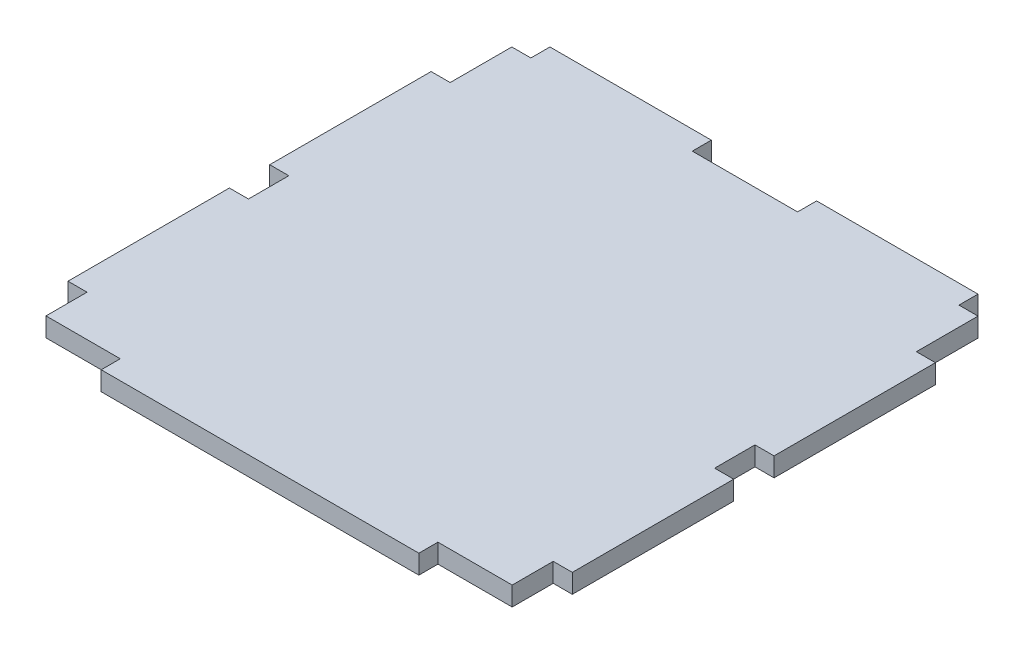
ISO-10303-21;
HEADER;
FILE_DESCRIPTION(('STEP AP214'),'2;1');
FILE_NAME('part.step','',(''),(''),'','','');
FILE_SCHEMA(('AUTOMOTIVE_DESIGN { 1 0 10303 214 1 1 1 1 }'));
ENDSEC;
DATA;
#1=APPLICATION_CONTEXT('core data for automotive mechanical design processes');
#2=APPLICATION_PROTOCOL_DEFINITION('international standard','automotive_design',2000,#1);
#3=PRODUCT_CONTEXT('',#1,'mechanical');
#4=PRODUCT('Part','Part','',(#3));
#5=PRODUCT_RELATED_PRODUCT_CATEGORY('part','',(#4));
#6=PRODUCT_DEFINITION_FORMATION('','',#4);
#7=PRODUCT_DEFINITION_CONTEXT('part definition',#1,'design');
#8=PRODUCT_DEFINITION('design','',#6,#7);
#9=PRODUCT_DEFINITION_SHAPE('','',#8);
#10=(LENGTH_UNIT() NAMED_UNIT(*) SI_UNIT(.MILLI.,.METRE.));
#11=(NAMED_UNIT(*) PLANE_ANGLE_UNIT() SI_UNIT($,.RADIAN.));
#12=(NAMED_UNIT(*) SI_UNIT($,.STERADIAN.) SOLID_ANGLE_UNIT());
#13=UNCERTAINTY_MEASURE_WITH_UNIT(LENGTH_MEASURE(1.E-05),#10,'distance_accuracy_value','');
#14=(GEOMETRIC_REPRESENTATION_CONTEXT(3) GLOBAL_UNCERTAINTY_ASSIGNED_CONTEXT((#13)) GLOBAL_UNIT_ASSIGNED_CONTEXT((#10,
#11,#12)) REPRESENTATION_CONTEXT('',''));
#15=CARTESIAN_POINT('',(0.,0.,0.));
#16=DIRECTION('',(0.,0.,1.));
#17=DIRECTION('',(1.,0.,0.));
#18=AXIS2_PLACEMENT_3D('',#15,#16,#17);
#19=CARTESIAN_POINT('',(0.,3.,35.155));
#20=DIRECTION('',(0.,0.,1.));
#21=DIRECTION('',(1.,0.,0.));
#22=AXIS2_PLACEMENT_3D('',#19,#20,#21);
#23=PLANE('',#22);
#24=DIRECTION('',(-1.,0.,0.));
#25=VECTOR('',#24,1.);
#26=CARTESIAN_POINT('',(0.,0.,35.155));
#27=LINE('',#26,#25);
#28=CARTESIAN_POINT('',(36.685,0.,35.155));
#29=VERTEX_POINT('',#28);
#30=CARTESIAN_POINT('',(24.995,0.,35.155));
#31=VERTEX_POINT('',#30);
#32=EDGE_CURVE('E271',#29,#31,#27,.T.);
#33=ORIENTED_EDGE('',*,*,#32,.F.);
#34=DIRECTION('',(0.,-1.,0.));
#35=VECTOR('',#34,1.);
#36=CARTESIAN_POINT('',(36.685,3.,35.155));
#37=LINE('',#36,#35);
#38=CARTESIAN_POINT('',(36.685,3.,35.155));
#39=VERTEX_POINT('',#38);
#40=EDGE_CURVE('E11',#39,#29,#37,.T.);
#41=ORIENTED_EDGE('',*,*,#40,.F.);
#42=DIRECTION('',(-1.,0.,0.));
#43=VECTOR('',#42,1.);
#44=CARTESIAN_POINT('',(0.,3.,35.155));
#45=LINE('',#44,#43);
#46=CARTESIAN_POINT('',(24.995,3.,35.155));
#47=VERTEX_POINT('',#46);
#48=EDGE_CURVE('E349',#39,#47,#45,.T.);
#49=ORIENTED_EDGE('',*,*,#48,.T.);
#50=DIRECTION('',(0.,-1.,0.));
#51=VECTOR('',#50,1.);
#52=CARTESIAN_POINT('',(24.995,3.,35.155));
#53=LINE('',#52,#51);
#54=EDGE_CURVE('E48',#47,#31,#53,.T.);
#55=ORIENTED_EDGE('',*,*,#54,.T.);
#56=EDGE_LOOP('',(#33,#41,#49,#55));
#57=FACE_BOUND('',#56,.T.);
#58=ADVANCED_FACE('F32',(#57),#23,.T.);
#59=CARTESIAN_POINT('',(36.685,3.,0.));
#60=DIRECTION('',(-1.,0.,0.));
#61=DIRECTION('',(0.,0.,1.));
#62=AXIS2_PLACEMENT_3D('',#59,#60,#61);
#63=PLANE('',#62);
#64=DIRECTION('',(0.,0.,-1.));
#65=VECTOR('',#64,1.);
#66=CARTESIAN_POINT('',(36.685,0.,0.));
#67=LINE('',#66,#65);
#68=CARTESIAN_POINT('',(36.685,0.,28.695));
#69=VERTEX_POINT('',#68);
#70=EDGE_CURVE('E273',#29,#69,#67,.T.);
#71=ORIENTED_EDGE('',*,*,#70,.T.);
#72=DIRECTION('',(0.,-1.,0.));
#73=VECTOR('',#72,1.);
#74=CARTESIAN_POINT('',(36.685,3.,28.695));
#75=LINE('',#74,#73);
#76=CARTESIAN_POINT('',(36.685,3.,28.695));
#77=VERTEX_POINT('',#76);
#78=EDGE_CURVE('E40',#77,#69,#75,.T.);
#79=ORIENTED_EDGE('',*,*,#78,.F.);
#80=DIRECTION('',(0.,0.,-1.));
#81=VECTOR('',#80,1.);
#82=CARTESIAN_POINT('',(36.685,3.,0.));
#83=LINE('',#82,#81);
#84=EDGE_CURVE('E878',#39,#77,#83,.T.);
#85=ORIENTED_EDGE('',*,*,#84,.F.);
#86=ORIENTED_EDGE('',*,*,#40,.T.);
#87=EDGE_LOOP('',(#71,#79,#85,#86));
#88=FACE_BOUND('',#87,.T.);
#89=ADVANCED_FACE('F525',(#88),#63,.F.);
#90=CARTESIAN_POINT('',(0.,3.,28.695));
#91=DIRECTION('',(0.,0.,-1.));
#92=DIRECTION('',(-1.,0.,0.));
#93=AXIS2_PLACEMENT_3D('',#90,#91,#92);
#94=PLANE('',#93);
#95=DIRECTION('',(1.,0.,0.));
#96=VECTOR('',#95,1.);
#97=CARTESIAN_POINT('',(0.,0.,28.695));
#98=LINE('',#97,#96);
#99=CARTESIAN_POINT('',(39.685,0.,28.695));
#100=VERTEX_POINT('',#99);
#101=EDGE_CURVE('E275',#69,#100,#98,.T.);
#102=ORIENTED_EDGE('',*,*,#101,.T.);
#103=DIRECTION('',(0.,-1.,0.));
#104=VECTOR('',#103,1.);
#105=CARTESIAN_POINT('',(39.685,3.,28.695));
#106=LINE('',#105,#104);
#107=CARTESIAN_POINT('',(39.685,3.,28.695));
#108=VERTEX_POINT('',#107);
#109=EDGE_CURVE('E414',#108,#100,#106,.T.);
#110=ORIENTED_EDGE('',*,*,#109,.F.);
#111=DIRECTION('',(1.,0.,0.));
#112=VECTOR('',#111,1.);
#113=CARTESIAN_POINT('',(0.,3.,28.695));
#114=LINE('',#113,#112);
#115=EDGE_CURVE('E423',#77,#108,#114,.T.);
#116=ORIENTED_EDGE('',*,*,#115,.F.);
#117=ORIENTED_EDGE('',*,*,#78,.T.);
#118=EDGE_LOOP('',(#102,#110,#116,#117));
#119=FACE_BOUND('',#118,.T.);
#120=ADVANCED_FACE('F421',(#119),#94,.F.);
#121=CARTESIAN_POINT('',(39.685,3.,0.));
#122=DIRECTION('',(-1.,0.,0.));
#123=DIRECTION('',(0.,0.,1.));
#124=AXIS2_PLACEMENT_3D('',#121,#122,#123);
#125=PLANE('',#124);
#126=DIRECTION('',(0.,0.,-1.));
#127=VECTOR('',#126,1.);
#128=CARTESIAN_POINT('',(39.685,0.,0.));
#129=LINE('',#128,#127);
#130=CARTESIAN_POINT('',(39.685,0.,3.29499999999999));
#131=VERTEX_POINT('',#130);
#132=EDGE_CURVE('E277',#100,#131,#129,.T.);
#133=ORIENTED_EDGE('',*,*,#132,.T.);
#134=DIRECTION('',(0.,-1.,0.));
#135=VECTOR('',#134,1.);
#136=CARTESIAN_POINT('',(39.685,3.,3.29499999999999));
#137=LINE('',#136,#135);
#138=CARTESIAN_POINT('',(39.685,3.,3.29499999999999));
#139=VERTEX_POINT('',#138);
#140=EDGE_CURVE('E411',#139,#131,#137,.T.);
#141=ORIENTED_EDGE('',*,*,#140,.F.);
#142=DIRECTION('',(0.,0.,-1.));
#143=VECTOR('',#142,1.);
#144=CARTESIAN_POINT('',(39.685,3.,0.));
#145=LINE('',#144,#143);
#146=EDGE_CURVE('E442',#108,#139,#145,.T.);
#147=ORIENTED_EDGE('',*,*,#146,.F.);
#148=ORIENTED_EDGE('',*,*,#109,.T.);
#149=EDGE_LOOP('',(#133,#141,#147,#148));
#150=FACE_BOUND('',#149,.T.);
#151=ADVANCED_FACE('F433',(#150),#125,.F.);
#152=CARTESIAN_POINT('',(0.,3.,3.29499999999998));
#153=DIRECTION('',(0.,0.,1.));
#154=DIRECTION('',(1.,0.,0.));
#155=AXIS2_PLACEMENT_3D('',#152,#153,#154);
#156=PLANE('',#155);
#157=DIRECTION('',(-1.,0.,0.));
#158=VECTOR('',#157,1.);
#159=CARTESIAN_POINT('',(0.,0.,3.29499999999998));
#160=LINE('',#159,#158);
#161=CARTESIAN_POINT('',(36.685,0.,3.29499999999999));
#162=VERTEX_POINT('',#161);
#163=EDGE_CURVE('E279',#131,#162,#160,.T.);
#164=ORIENTED_EDGE('',*,*,#163,.T.);
#165=DIRECTION('',(0.,-1.,0.));
#166=VECTOR('',#165,1.);
#167=CARTESIAN_POINT('',(36.685,3.,3.29499999999999));
#168=LINE('',#167,#166);
#169=CARTESIAN_POINT('',(36.685,3.,3.29499999999999));
#170=VERTEX_POINT('',#169);
#171=EDGE_CURVE('E408',#170,#162,#168,.T.);
#172=ORIENTED_EDGE('',*,*,#171,.F.);
#173=DIRECTION('',(-1.,0.,0.));
#174=VECTOR('',#173,1.);
#175=CARTESIAN_POINT('',(0.,3.,3.29499999999998));
#176=LINE('',#175,#174);
#177=EDGE_CURVE('E439',#139,#170,#176,.T.);
#178=ORIENTED_EDGE('',*,*,#177,.F.);
#179=ORIENTED_EDGE('',*,*,#140,.T.);
#180=EDGE_LOOP('',(#164,#172,#178,#179));
#181=FACE_BOUND('',#180,.T.);
#182=ADVANCED_FACE('F437',(#181),#156,.F.);
#183=CARTESIAN_POINT('',(36.685,3.,0.));
#184=DIRECTION('',(-1.,0.,0.));
#185=DIRECTION('',(0.,0.,1.));
#186=AXIS2_PLACEMENT_3D('',#183,#184,#185);
#187=PLANE('',#186);
#188=DIRECTION('',(0.,0.,-1.));
#189=VECTOR('',#188,1.);
#190=CARTESIAN_POINT('',(36.685,0.,0.));
#191=LINE('',#190,#189);
#192=CARTESIAN_POINT('',(36.685,0.,-3.05500000000001));
#193=VERTEX_POINT('',#192);
#194=EDGE_CURVE('E281',#162,#193,#191,.T.);
#195=ORIENTED_EDGE('',*,*,#194,.T.);
#196=DIRECTION('',(0.,-1.,0.));
#197=VECTOR('',#196,1.);
#198=CARTESIAN_POINT('',(36.685,3.,-3.05500000000001));
#199=LINE('',#198,#197);
#200=CARTESIAN_POINT('',(36.685,3.,-3.05500000000001));
#201=VERTEX_POINT('',#200);
#202=EDGE_CURVE('E405',#201,#193,#199,.T.);
#203=ORIENTED_EDGE('',*,*,#202,.F.);
#204=DIRECTION('',(0.,0.,-1.));
#205=VECTOR('',#204,1.);
#206=CARTESIAN_POINT('',(36.685,3.,0.));
#207=LINE('',#206,#205);
#208=EDGE_CURVE('E441',#170,#201,#207,.T.);
#209=ORIENTED_EDGE('',*,*,#208,.F.);
#210=ORIENTED_EDGE('',*,*,#171,.T.);
#211=EDGE_LOOP('',(#195,#203,#209,#210));
#212=FACE_BOUND('',#211,.T.);
#213=ADVANCED_FACE('F780',(#212),#187,.F.);
#214=CARTESIAN_POINT('',(0.,3.,-3.05500000000001));
#215=DIRECTION('',(0.,0.,-1.));
#216=DIRECTION('',(-1.,0.,0.));
#217=AXIS2_PLACEMENT_3D('',#214,#215,#216);
#218=PLANE('',#217);
#219=DIRECTION('',(1.,0.,0.));
#220=VECTOR('',#219,1.);
#221=CARTESIAN_POINT('',(0.,0.,-3.05500000000001));
#222=LINE('',#221,#220);
#223=CARTESIAN_POINT('',(39.685,0.,-3.05500000000001));
#224=VERTEX_POINT('',#223);
#225=EDGE_CURVE('E283',#193,#224,#222,.T.);
#226=ORIENTED_EDGE('',*,*,#225,.T.);
#227=DIRECTION('',(0.,-1.,0.));
#228=VECTOR('',#227,1.);
#229=CARTESIAN_POINT('',(39.685,3.,-3.05500000000001));
#230=LINE('',#229,#228);
#231=CARTESIAN_POINT('',(39.685,3.,-3.05500000000001));
#232=VERTEX_POINT('',#231);
#233=EDGE_CURVE('E402',#232,#224,#230,.T.);
#234=ORIENTED_EDGE('',*,*,#233,.F.);
#235=DIRECTION('',(1.,0.,0.));
#236=VECTOR('',#235,1.);
#237=CARTESIAN_POINT('',(0.,3.,-3.05500000000001));
#238=LINE('',#237,#236);
#239=EDGE_CURVE('E444',#201,#232,#238,.T.);
#240=ORIENTED_EDGE('',*,*,#239,.F.);
#241=ORIENTED_EDGE('',*,*,#202,.T.);
#242=EDGE_LOOP('',(#226,#234,#240,#241));
#243=FACE_BOUND('',#242,.T.);
#244=ADVANCED_FACE('F770',(#243),#218,.F.);
#245=CARTESIAN_POINT('',(39.685,3.,0.));
#246=DIRECTION('',(-1.,0.,0.));
#247=DIRECTION('',(0.,0.,1.));
#248=AXIS2_PLACEMENT_3D('',#245,#246,#247);
#249=PLANE('',#248);
#250=DIRECTION('',(0.,0.,-1.));
#251=VECTOR('',#250,1.);
#252=CARTESIAN_POINT('',(39.685,0.,0.));
#253=LINE('',#252,#251);
#254=CARTESIAN_POINT('',(39.685,0.,-28.455));
#255=VERTEX_POINT('',#254);
#256=EDGE_CURVE('E285',#224,#255,#253,.T.);
#257=ORIENTED_EDGE('',*,*,#256,.T.);
#258=DIRECTION('',(0.,-1.,0.));
#259=VECTOR('',#258,1.);
#260=CARTESIAN_POINT('',(39.685,3.,-28.455));
#261=LINE('',#260,#259);
#262=CARTESIAN_POINT('',(39.685,3.,-28.455));
#263=VERTEX_POINT('',#262);
#264=EDGE_CURVE('E399',#263,#255,#261,.T.);
#265=ORIENTED_EDGE('',*,*,#264,.F.);
#266=DIRECTION('',(0.,0.,-1.));
#267=VECTOR('',#266,1.);
#268=CARTESIAN_POINT('',(39.685,3.,0.));
#269=LINE('',#268,#267);
#270=EDGE_CURVE('E450',#232,#263,#269,.T.);
#271=ORIENTED_EDGE('',*,*,#270,.F.);
#272=ORIENTED_EDGE('',*,*,#233,.T.);
#273=EDGE_LOOP('',(#257,#265,#271,#272));
#274=FACE_BOUND('',#273,.T.);
#275=ADVANCED_FACE('F760',(#274),#249,.F.);
#276=CARTESIAN_POINT('',(0.,3.,-28.455));
#277=DIRECTION('',(0.,0.,1.));
#278=DIRECTION('',(1.,0.,0.));
#279=AXIS2_PLACEMENT_3D('',#276,#277,#278);
#280=PLANE('',#279);
#281=DIRECTION('',(-1.,0.,0.));
#282=VECTOR('',#281,1.);
#283=CARTESIAN_POINT('',(0.,0.,-28.455));
#284=LINE('',#283,#282);
#285=CARTESIAN_POINT('',(36.685,0.,-28.455));
#286=VERTEX_POINT('',#285);
#287=EDGE_CURVE('E287',#255,#286,#284,.T.);
#288=ORIENTED_EDGE('',*,*,#287,.T.);
#289=DIRECTION('',(0.,-1.,0.));
#290=VECTOR('',#289,1.);
#291=CARTESIAN_POINT('',(36.685,3.,-28.455));
#292=LINE('',#291,#290);
#293=CARTESIAN_POINT('',(36.685,3.,-28.455));
#294=VERTEX_POINT('',#293);
#295=EDGE_CURVE('E396',#294,#286,#292,.T.);
#296=ORIENTED_EDGE('',*,*,#295,.F.);
#297=DIRECTION('',(-1.,0.,0.));
#298=VECTOR('',#297,1.);
#299=CARTESIAN_POINT('',(0.,3.,-28.455));
#300=LINE('',#299,#298);
#301=EDGE_CURVE('E452',#263,#294,#300,.T.);
#302=ORIENTED_EDGE('',*,*,#301,.F.);
#303=ORIENTED_EDGE('',*,*,#264,.T.);
#304=EDGE_LOOP('',(#288,#296,#302,#303));
#305=FACE_BOUND('',#304,.T.);
#306=ADVANCED_FACE('F750',(#305),#280,.F.);
#307=CARTESIAN_POINT('',(36.685,3.,0.));
#308=DIRECTION('',(-1.,0.,0.));
#309=DIRECTION('',(0.,0.,1.));
#310=AXIS2_PLACEMENT_3D('',#307,#308,#309);
#311=PLANE('',#310);
#312=DIRECTION('',(0.,0.,-1.));
#313=VECTOR('',#312,1.);
#314=CARTESIAN_POINT('',(36.685,0.,0.));
#315=LINE('',#314,#313);
#316=CARTESIAN_POINT('',(36.685,0.,-38.155));
#317=VERTEX_POINT('',#316);
#318=EDGE_CURVE('E289',#286,#317,#315,.T.);
#319=ORIENTED_EDGE('',*,*,#318,.T.);
#320=DIRECTION('',(0.,-1.,0.));
#321=VECTOR('',#320,1.);
#322=CARTESIAN_POINT('',(36.685,3.,-38.155));
#323=LINE('',#322,#321);
#324=CARTESIAN_POINT('',(36.685,3.,-38.155));
#325=VERTEX_POINT('',#324);
#326=EDGE_CURVE('E393',#325,#317,#323,.T.);
#327=ORIENTED_EDGE('',*,*,#326,.F.);
#328=DIRECTION('',(0.,0.,-1.));
#329=VECTOR('',#328,1.);
#330=CARTESIAN_POINT('',(36.685,3.,0.));
#331=LINE('',#330,#329);
#332=EDGE_CURVE('E454',#294,#325,#331,.T.);
#333=ORIENTED_EDGE('',*,*,#332,.F.);
#334=ORIENTED_EDGE('',*,*,#295,.T.);
#335=EDGE_LOOP('',(#319,#327,#333,#334));
#336=FACE_BOUND('',#335,.T.);
#337=ADVANCED_FACE('F740',(#336),#311,.F.);
#338=CARTESIAN_POINT('',(3.53004662538112E-13,3.,-38.1550000000003));
#339=DIRECTION('',(0.,0.,1.));
#340=DIRECTION('',(1.,0.,0.));
#341=AXIS2_PLACEMENT_3D('',#338,#339,#340);
#342=PLANE('',#341);
#343=DIRECTION('',(-1.,0.,0.));
#344=VECTOR('',#343,1.);
#345=CARTESIAN_POINT('',(3.53004662538112E-13,0.,-38.1550000000003));
#346=LINE('',#345,#344);
#347=CARTESIAN_POINT('',(33.685,0.,-38.155));
#348=VERTEX_POINT('',#347);
#349=EDGE_CURVE('E291',#317,#348,#346,.T.);
#350=ORIENTED_EDGE('',*,*,#349,.T.);
#351=DIRECTION('',(0.,-1.,0.));
#352=VECTOR('',#351,1.);
#353=CARTESIAN_POINT('',(33.685,3.,-38.155));
#354=LINE('',#353,#352);
#355=CARTESIAN_POINT('',(33.685,3.,-38.155));
#356=VERTEX_POINT('',#355);
#357=EDGE_CURVE('E390',#356,#348,#354,.T.);
#358=ORIENTED_EDGE('',*,*,#357,.F.);
#359=DIRECTION('',(-1.,0.,0.));
#360=VECTOR('',#359,1.);
#361=CARTESIAN_POINT('',(3.53004662538112E-13,3.,-38.1550000000003));
#362=LINE('',#361,#360);
#363=EDGE_CURVE('E456',#325,#356,#362,.T.);
#364=ORIENTED_EDGE('',*,*,#363,.F.);
#365=ORIENTED_EDGE('',*,*,#326,.T.);
#366=EDGE_LOOP('',(#350,#358,#364,#365));
#367=FACE_BOUND('',#366,.T.);
#368=ADVANCED_FACE('F730',(#367),#342,.F.);
#369=CARTESIAN_POINT('',(33.685,3.,0.));
#370=DIRECTION('',(-1.,0.,0.));
#371=DIRECTION('',(0.,0.,1.));
#372=AXIS2_PLACEMENT_3D('',#369,#370,#371);
#373=PLANE('',#372);
#374=DIRECTION('',(0.,0.,-1.));
#375=VECTOR('',#374,1.);
#376=CARTESIAN_POINT('',(33.685,0.,0.));
#377=LINE('',#376,#375);
#378=CARTESIAN_POINT('',(33.685,0.,-41.155));
#379=VERTEX_POINT('',#378);
#380=EDGE_CURVE('E293',#348,#379,#377,.T.);
#381=ORIENTED_EDGE('',*,*,#380,.T.);
#382=DIRECTION('',(0.,-1.,0.));
#383=VECTOR('',#382,1.);
#384=CARTESIAN_POINT('',(33.685,3.,-41.155));
#385=LINE('',#384,#383);
#386=CARTESIAN_POINT('',(33.685,3.,-41.155));
#387=VERTEX_POINT('',#386);
#388=EDGE_CURVE('E387',#387,#379,#385,.T.);
#389=ORIENTED_EDGE('',*,*,#388,.F.);
#390=DIRECTION('',(0.,0.,-1.));
#391=VECTOR('',#390,1.);
#392=CARTESIAN_POINT('',(33.685,3.,0.));
#393=LINE('',#392,#391);
#394=EDGE_CURVE('E458',#356,#387,#393,.T.);
#395=ORIENTED_EDGE('',*,*,#394,.F.);
#396=ORIENTED_EDGE('',*,*,#357,.T.);
#397=EDGE_LOOP('',(#381,#389,#395,#396));
#398=FACE_BOUND('',#397,.T.);
#399=ADVANCED_FACE('F720',(#398),#373,.F.);
#400=CARTESIAN_POINT('',(0.,3.,-41.155));
#401=DIRECTION('',(0.,0.,1.));
#402=DIRECTION('',(1.,0.,0.));
#403=AXIS2_PLACEMENT_3D('',#400,#401,#402);
#404=PLANE('',#403);
#405=DIRECTION('',(-1.,0.,0.));
#406=VECTOR('',#405,1.);
#407=CARTESIAN_POINT('',(0.,0.,-41.155));
#408=LINE('',#407,#406);
#409=CARTESIAN_POINT('',(8.285,0.,-41.155));
#410=VERTEX_POINT('',#409);
#411=EDGE_CURVE('E295',#379,#410,#408,.T.);
#412=ORIENTED_EDGE('',*,*,#411,.T.);
#413=DIRECTION('',(0.,-1.,0.));
#414=VECTOR('',#413,1.);
#415=CARTESIAN_POINT('',(8.285,3.,-41.155));
#416=LINE('',#415,#414);
#417=CARTESIAN_POINT('',(8.285,3.,-41.155));
#418=VERTEX_POINT('',#417);
#419=EDGE_CURVE('E385',#418,#410,#416,.T.);
#420=ORIENTED_EDGE('',*,*,#419,.F.);
#421=DIRECTION('',(-1.,0.,0.));
#422=VECTOR('',#421,1.);
#423=CARTESIAN_POINT('',(0.,3.,-41.155));
#424=LINE('',#423,#422);
#425=EDGE_CURVE('E460',#387,#418,#424,.T.);
#426=ORIENTED_EDGE('',*,*,#425,.F.);
#427=ORIENTED_EDGE('',*,*,#388,.T.);
#428=EDGE_LOOP('',(#412,#420,#426,#427));
#429=FACE_BOUND('',#428,.T.);
#430=ADVANCED_FACE('F710',(#429),#404,.F.);
#431=CARTESIAN_POINT('',(8.285,3.,0.));
#432=DIRECTION('',(-1.,0.,0.));
#433=DIRECTION('',(0.,0.,1.));
#434=AXIS2_PLACEMENT_3D('',#431,#432,#433);
#435=PLANE('',#434);
#436=DIRECTION('',(0.,0.,-1.));
#437=VECTOR('',#436,1.);
#438=CARTESIAN_POINT('',(8.285,0.,0.));
#439=LINE('',#438,#437);
#440=CARTESIAN_POINT('',(8.285,0.,-38.155));
#441=VERTEX_POINT('',#440);
#442=EDGE_CURVE('E298',#441,#410,#439,.T.);
#443=ORIENTED_EDGE('',*,*,#442,.F.);
#444=DIRECTION('',(0.,-1.,0.));
#445=VECTOR('',#444,1.);
#446=CARTESIAN_POINT('',(8.285,3.,-38.155));
#447=LINE('',#446,#445);
#448=CARTESIAN_POINT('',(8.285,3.,-38.155));
#449=VERTEX_POINT('',#448);
#450=EDGE_CURVE('E383',#449,#441,#447,.T.);
#451=ORIENTED_EDGE('',*,*,#450,.F.);
#452=DIRECTION('',(0.,0.,-1.));
#453=VECTOR('',#452,1.);
#454=CARTESIAN_POINT('',(8.285,3.,0.));
#455=LINE('',#454,#453);
#456=EDGE_CURVE('E462',#449,#418,#455,.T.);
#457=ORIENTED_EDGE('',*,*,#456,.T.);
#458=ORIENTED_EDGE('',*,*,#419,.T.);
#459=EDGE_LOOP('',(#443,#451,#457,#458));
#460=FACE_BOUND('',#459,.T.);
#461=ADVANCED_FACE('F700',(#460),#435,.T.);
#462=CARTESIAN_POINT('',(0.,3.,-38.155));
#463=DIRECTION('',(0.,0.,1.));
#464=DIRECTION('',(1.,0.,0.));
#465=AXIS2_PLACEMENT_3D('',#462,#463,#464);
#466=PLANE('',#465);
#467=DIRECTION('',(-1.,0.,0.));
#468=VECTOR('',#467,1.);
#469=CARTESIAN_POINT('',(0.,0.,-38.155));
#470=LINE('',#469,#468);
#471=CARTESIAN_POINT('',(-8.28499999999999,0.,-38.155));
#472=VERTEX_POINT('',#471);
#473=EDGE_CURVE('E301',#441,#472,#470,.T.);
#474=ORIENTED_EDGE('',*,*,#473,.T.);
#475=DIRECTION('',(0.,-1.,0.));
#476=VECTOR('',#475,1.);
#477=CARTESIAN_POINT('',(-8.28499999999999,3.,-38.155));
#478=LINE('',#477,#476);
#479=CARTESIAN_POINT('',(-8.28499999999999,3.,-38.155));
#480=VERTEX_POINT('',#479);
#481=EDGE_CURVE('E380',#480,#472,#478,.T.);
#482=ORIENTED_EDGE('',*,*,#481,.F.);
#483=DIRECTION('',(-1.,0.,0.));
#484=VECTOR('',#483,1.);
#485=CARTESIAN_POINT('',(0.,3.,-38.155));
#486=LINE('',#485,#484);
#487=EDGE_CURVE('E465',#449,#480,#486,.T.);
#488=ORIENTED_EDGE('',*,*,#487,.F.);
#489=ORIENTED_EDGE('',*,*,#450,.T.);
#490=EDGE_LOOP('',(#474,#482,#488,#489));
#491=FACE_BOUND('',#490,.T.);
#492=ADVANCED_FACE('F690',(#491),#466,.F.);
#493=CARTESIAN_POINT('',(-8.28499999999999,3.,0.));
#494=DIRECTION('',(-1.,0.,0.));
#495=DIRECTION('',(0.,0.,1.));
#496=AXIS2_PLACEMENT_3D('',#493,#494,#495);
#497=PLANE('',#496);
#498=DIRECTION('',(0.,0.,-1.));
#499=VECTOR('',#498,1.);
#500=CARTESIAN_POINT('',(-8.28499999999999,0.,0.));
#501=LINE('',#500,#499);
#502=CARTESIAN_POINT('',(-8.28499999999999,0.,-41.155));
#503=VERTEX_POINT('',#502);
#504=EDGE_CURVE('E303',#472,#503,#501,.T.);
#505=ORIENTED_EDGE('',*,*,#504,.T.);
#506=DIRECTION('',(0.,-1.,0.));
#507=VECTOR('',#506,1.);
#508=CARTESIAN_POINT('',(-8.28499999999999,3.,-41.155));
#509=LINE('',#508,#507);
#510=CARTESIAN_POINT('',(-8.28499999999999,3.,-41.155));
#511=VERTEX_POINT('',#510);
#512=EDGE_CURVE('E377',#511,#503,#509,.T.);
#513=ORIENTED_EDGE('',*,*,#512,.F.);
#514=DIRECTION('',(0.,0.,-1.));
#515=VECTOR('',#514,1.);
#516=CARTESIAN_POINT('',(-8.28499999999999,3.,0.));
#517=LINE('',#516,#515);
#518=EDGE_CURVE('E467',#480,#511,#517,.T.);
#519=ORIENTED_EDGE('',*,*,#518,.F.);
#520=ORIENTED_EDGE('',*,*,#481,.T.);
#521=EDGE_LOOP('',(#505,#513,#519,#520));
#522=FACE_BOUND('',#521,.T.);
#523=ADVANCED_FACE('F680',(#522),#497,.F.);
#524=CARTESIAN_POINT('',(0.,3.,-41.155));
#525=DIRECTION('',(0.,0.,1.));
#526=DIRECTION('',(1.,0.,0.));
#527=AXIS2_PLACEMENT_3D('',#524,#525,#526);
#528=PLANE('',#527);
#529=DIRECTION('',(-1.,0.,0.));
#530=VECTOR('',#529,1.);
#531=CARTESIAN_POINT('',(0.,0.,-41.155));
#532=LINE('',#531,#530);
#533=CARTESIAN_POINT('',(-33.685,0.,-41.155));
#534=VERTEX_POINT('',#533);
#535=EDGE_CURVE('E305',#503,#534,#532,.T.);
#536=ORIENTED_EDGE('',*,*,#535,.T.);
#537=DIRECTION('',(0.,-1.,0.));
#538=VECTOR('',#537,1.);
#539=CARTESIAN_POINT('',(-33.685,3.,-41.155));
#540=LINE('',#539,#538);
#541=CARTESIAN_POINT('',(-33.685,3.,-41.155));
#542=VERTEX_POINT('',#541);
#543=EDGE_CURVE('E375',#542,#534,#540,.T.);
#544=ORIENTED_EDGE('',*,*,#543,.F.);
#545=DIRECTION('',(-1.,0.,0.));
#546=VECTOR('',#545,1.);
#547=CARTESIAN_POINT('',(0.,3.,-41.155));
#548=LINE('',#547,#546);
#549=EDGE_CURVE('E469',#511,#542,#548,.T.);
#550=ORIENTED_EDGE('',*,*,#549,.F.);
#551=ORIENTED_EDGE('',*,*,#512,.T.);
#552=EDGE_LOOP('',(#536,#544,#550,#551));
#553=FACE_BOUND('',#552,.T.);
#554=ADVANCED_FACE('F670',(#553),#528,.F.);
#555=CARTESIAN_POINT('',(-33.685,3.,0.));
#556=DIRECTION('',(-1.,0.,0.));
#557=DIRECTION('',(0.,0.,1.));
#558=AXIS2_PLACEMENT_3D('',#555,#556,#557);
#559=PLANE('',#558);
#560=DIRECTION('',(0.,0.,-1.));
#561=VECTOR('',#560,1.);
#562=CARTESIAN_POINT('',(-33.685,0.,0.));
#563=LINE('',#562,#561);
#564=CARTESIAN_POINT('',(-33.685,0.,-38.155));
#565=VERTEX_POINT('',#564);
#566=EDGE_CURVE('E308',#565,#534,#563,.T.);
#567=ORIENTED_EDGE('',*,*,#566,.F.);
#568=DIRECTION('',(0.,-1.,0.));
#569=VECTOR('',#568,1.);
#570=CARTESIAN_POINT('',(-33.685,3.,-38.155));
#571=LINE('',#570,#569);
#572=CARTESIAN_POINT('',(-33.685,3.,-38.155));
#573=VERTEX_POINT('',#572);
#574=EDGE_CURVE('E373',#573,#565,#571,.T.);
#575=ORIENTED_EDGE('',*,*,#574,.F.);
#576=DIRECTION('',(0.,0.,-1.));
#577=VECTOR('',#576,1.);
#578=CARTESIAN_POINT('',(-33.685,3.,0.));
#579=LINE('',#578,#577);
#580=EDGE_CURVE('E471',#573,#542,#579,.T.);
#581=ORIENTED_EDGE('',*,*,#580,.T.);
#582=ORIENTED_EDGE('',*,*,#543,.T.);
#583=EDGE_LOOP('',(#567,#575,#581,#582));
#584=FACE_BOUND('',#583,.T.);
#585=ADVANCED_FACE('F660',(#584),#559,.T.);
#586=CARTESIAN_POINT('',(0.,3.,-38.1549999999999));
#587=DIRECTION('',(0.,0.,-1.));
#588=DIRECTION('',(-1.,0.,0.));
#589=AXIS2_PLACEMENT_3D('',#586,#587,#588);
#590=PLANE('',#589);
#591=DIRECTION('',(1.,0.,0.));
#592=VECTOR('',#591,1.);
#593=CARTESIAN_POINT('',(0.,0.,-38.1549999999999));
#594=LINE('',#593,#592);
#595=CARTESIAN_POINT('',(-36.685,0.,-38.155));
#596=VERTEX_POINT('',#595);
#597=EDGE_CURVE('E311',#596,#565,#594,.T.);
#598=ORIENTED_EDGE('',*,*,#597,.F.);
#599=DIRECTION('',(0.,-1.,0.));
#600=VECTOR('',#599,1.);
#601=CARTESIAN_POINT('',(-36.685,3.,-38.155));
#602=LINE('',#601,#600);
#603=CARTESIAN_POINT('',(-36.685,3.,-38.155));
#604=VERTEX_POINT('',#603);
#605=EDGE_CURVE('E371',#604,#596,#602,.T.);
#606=ORIENTED_EDGE('',*,*,#605,.F.);
#607=DIRECTION('',(1.,0.,0.));
#608=VECTOR('',#607,1.);
#609=CARTESIAN_POINT('',(0.,3.,-38.1549999999999));
#610=LINE('',#609,#608);
#611=EDGE_CURVE('E474',#604,#573,#610,.T.);
#612=ORIENTED_EDGE('',*,*,#611,.T.);
#613=ORIENTED_EDGE('',*,*,#574,.T.);
#614=EDGE_LOOP('',(#598,#606,#612,#613));
#615=FACE_BOUND('',#614,.T.);
#616=ADVANCED_FACE('F650',(#615),#590,.T.);
#617=CARTESIAN_POINT('',(-36.685,3.,0.));
#618=DIRECTION('',(-1.,0.,0.));
#619=DIRECTION('',(0.,0.,1.));
#620=AXIS2_PLACEMENT_3D('',#617,#618,#619);
#621=PLANE('',#620);
#622=DIRECTION('',(0.,0.,-1.));
#623=VECTOR('',#622,1.);
#624=CARTESIAN_POINT('',(-36.685,0.,0.));
#625=LINE('',#624,#623);
#626=CARTESIAN_POINT('',(-36.685,0.,-28.455));
#627=VERTEX_POINT('',#626);
#628=EDGE_CURVE('E314',#627,#596,#625,.T.);
#629=ORIENTED_EDGE('',*,*,#628,.F.);
#630=DIRECTION('',(0.,-1.,0.));
#631=VECTOR('',#630,1.);
#632=CARTESIAN_POINT('',(-36.685,3.,-28.455));
#633=LINE('',#632,#631);
#634=CARTESIAN_POINT('',(-36.685,3.,-28.455));
#635=VERTEX_POINT('',#634);
#636=EDGE_CURVE('E369',#635,#627,#633,.T.);
#637=ORIENTED_EDGE('',*,*,#636,.F.);
#638=DIRECTION('',(0.,0.,-1.));
#639=VECTOR('',#638,1.);
#640=CARTESIAN_POINT('',(-36.685,3.,0.));
#641=LINE('',#640,#639);
#642=EDGE_CURVE('E477',#635,#604,#641,.T.);
#643=ORIENTED_EDGE('',*,*,#642,.T.);
#644=ORIENTED_EDGE('',*,*,#605,.T.);
#645=EDGE_LOOP('',(#629,#637,#643,#644));
#646=FACE_BOUND('',#645,.T.);
#647=ADVANCED_FACE('F640',(#646),#621,.T.);
#648=CARTESIAN_POINT('',(0.,3.,-28.455));
#649=DIRECTION('',(0.,0.,-1.));
#650=DIRECTION('',(-1.,0.,0.));
#651=AXIS2_PLACEMENT_3D('',#648,#649,#650);
#652=PLANE('',#651);
#653=DIRECTION('',(1.,0.,0.));
#654=VECTOR('',#653,1.);
#655=CARTESIAN_POINT('',(0.,0.,-28.455));
#656=LINE('',#655,#654);
#657=CARTESIAN_POINT('',(-39.685,0.,-28.455));
#658=VERTEX_POINT('',#657);
#659=EDGE_CURVE('E317',#658,#627,#656,.T.);
#660=ORIENTED_EDGE('',*,*,#659,.F.);
#661=DIRECTION('',(0.,-1.,0.));
#662=VECTOR('',#661,1.);
#663=CARTESIAN_POINT('',(-39.685,3.,-28.455));
#664=LINE('',#663,#662);
#665=CARTESIAN_POINT('',(-39.685,3.,-28.455));
#666=VERTEX_POINT('',#665);
#667=EDGE_CURVE('E367',#666,#658,#664,.T.);
#668=ORIENTED_EDGE('',*,*,#667,.F.);
#669=DIRECTION('',(1.,0.,0.));
#670=VECTOR('',#669,1.);
#671=CARTESIAN_POINT('',(0.,3.,-28.455));
#672=LINE('',#671,#670);
#673=EDGE_CURVE('E480',#666,#635,#672,.T.);
#674=ORIENTED_EDGE('',*,*,#673,.T.);
#675=ORIENTED_EDGE('',*,*,#636,.T.);
#676=EDGE_LOOP('',(#660,#668,#674,#675));
#677=FACE_BOUND('',#676,.T.);
#678=ADVANCED_FACE('F630',(#677),#652,.T.);
#679=CARTESIAN_POINT('',(-39.685,3.,0.));
#680=DIRECTION('',(-1.,0.,0.));
#681=DIRECTION('',(0.,0.,1.));
#682=AXIS2_PLACEMENT_3D('',#679,#680,#681);
#683=PLANE('',#682);
#684=DIRECTION('',(0.,0.,-1.));
#685=VECTOR('',#684,1.);
#686=CARTESIAN_POINT('',(-39.685,0.,0.));
#687=LINE('',#686,#685);
#688=CARTESIAN_POINT('',(-39.685,0.,-3.055));
#689=VERTEX_POINT('',#688);
#690=EDGE_CURVE('E320',#689,#658,#687,.T.);
#691=ORIENTED_EDGE('',*,*,#690,.F.);
#692=DIRECTION('',(0.,-1.,0.));
#693=VECTOR('',#692,1.);
#694=CARTESIAN_POINT('',(-39.685,3.,-3.055));
#695=LINE('',#694,#693);
#696=CARTESIAN_POINT('',(-39.685,3.,-3.055));
#697=VERTEX_POINT('',#696);
#698=EDGE_CURVE('E365',#697,#689,#695,.T.);
#699=ORIENTED_EDGE('',*,*,#698,.F.);
#700=DIRECTION('',(0.,0.,-1.));
#701=VECTOR('',#700,1.);
#702=CARTESIAN_POINT('',(-39.685,3.,0.));
#703=LINE('',#702,#701);
#704=EDGE_CURVE('E483',#697,#666,#703,.T.);
#705=ORIENTED_EDGE('',*,*,#704,.T.);
#706=ORIENTED_EDGE('',*,*,#667,.T.);
#707=EDGE_LOOP('',(#691,#699,#705,#706));
#708=FACE_BOUND('',#707,.T.);
#709=ADVANCED_FACE('F620',(#708),#683,.T.);
#710=CARTESIAN_POINT('',(0.,3.,-3.055));
#711=DIRECTION('',(0.,0.,1.));
#712=DIRECTION('',(1.,0.,0.));
#713=AXIS2_PLACEMENT_3D('',#710,#711,#712);
#714=PLANE('',#713);
#715=DIRECTION('',(-1.,0.,0.));
#716=VECTOR('',#715,1.);
#717=CARTESIAN_POINT('',(0.,0.,-3.055));
#718=LINE('',#717,#716);
#719=CARTESIAN_POINT('',(-36.685,0.,-3.055));
#720=VERTEX_POINT('',#719);
#721=EDGE_CURVE('E323',#720,#689,#718,.T.);
#722=ORIENTED_EDGE('',*,*,#721,.F.);
#723=DIRECTION('',(0.,-1.,0.));
#724=VECTOR('',#723,1.);
#725=CARTESIAN_POINT('',(-36.685,3.,-3.055));
#726=LINE('',#725,#724);
#727=CARTESIAN_POINT('',(-36.685,3.,-3.055));
#728=VERTEX_POINT('',#727);
#729=EDGE_CURVE('E363',#728,#720,#726,.T.);
#730=ORIENTED_EDGE('',*,*,#729,.F.);
#731=DIRECTION('',(-1.,0.,0.));
#732=VECTOR('',#731,1.);
#733=CARTESIAN_POINT('',(0.,3.,-3.055));
#734=LINE('',#733,#732);
#735=EDGE_CURVE('E486',#728,#697,#734,.T.);
#736=ORIENTED_EDGE('',*,*,#735,.T.);
#737=ORIENTED_EDGE('',*,*,#698,.T.);
#738=EDGE_LOOP('',(#722,#730,#736,#737));
#739=FACE_BOUND('',#738,.T.);
#740=ADVANCED_FACE('F610',(#739),#714,.T.);
#741=CARTESIAN_POINT('',(-36.685,3.,0.));
#742=DIRECTION('',(-1.,0.,0.));
#743=DIRECTION('',(0.,0.,1.));
#744=AXIS2_PLACEMENT_3D('',#741,#742,#743);
#745=PLANE('',#744);
#746=DIRECTION('',(0.,0.,-1.));
#747=VECTOR('',#746,1.);
#748=CARTESIAN_POINT('',(-36.685,0.,0.));
#749=LINE('',#748,#747);
#750=CARTESIAN_POINT('',(-36.685,0.,3.295));
#751=VERTEX_POINT('',#750);
#752=EDGE_CURVE('E326',#751,#720,#749,.T.);
#753=ORIENTED_EDGE('',*,*,#752,.F.);
#754=DIRECTION('',(0.,-1.,0.));
#755=VECTOR('',#754,1.);
#756=CARTESIAN_POINT('',(-36.685,3.,3.295));
#757=LINE('',#756,#755);
#758=CARTESIAN_POINT('',(-36.685,3.,3.295));
#759=VERTEX_POINT('',#758);
#760=EDGE_CURVE('E361',#759,#751,#757,.T.);
#761=ORIENTED_EDGE('',*,*,#760,.F.);
#762=DIRECTION('',(0.,0.,-1.));
#763=VECTOR('',#762,1.);
#764=CARTESIAN_POINT('',(-36.685,3.,0.));
#765=LINE('',#764,#763);
#766=EDGE_CURVE('E489',#759,#728,#765,.T.);
#767=ORIENTED_EDGE('',*,*,#766,.T.);
#768=ORIENTED_EDGE('',*,*,#729,.T.);
#769=EDGE_LOOP('',(#753,#761,#767,#768));
#770=FACE_BOUND('',#769,.T.);
#771=ADVANCED_FACE('F600',(#770),#745,.T.);
#772=CARTESIAN_POINT('',(0.,3.,3.29499999999999));
#773=DIRECTION('',(0.,0.,-1.));
#774=DIRECTION('',(-1.,0.,0.));
#775=AXIS2_PLACEMENT_3D('',#772,#773,#774);
#776=PLANE('',#775);
#777=DIRECTION('',(1.,0.,0.));
#778=VECTOR('',#777,1.);
#779=CARTESIAN_POINT('',(0.,0.,3.29499999999999));
#780=LINE('',#779,#778);
#781=CARTESIAN_POINT('',(-39.685,0.,3.295));
#782=VERTEX_POINT('',#781);
#783=EDGE_CURVE('E329',#782,#751,#780,.T.);
#784=ORIENTED_EDGE('',*,*,#783,.F.);
#785=DIRECTION('',(0.,-1.,0.));
#786=VECTOR('',#785,1.);
#787=CARTESIAN_POINT('',(-39.685,3.,3.295));
#788=LINE('',#787,#786);
#789=CARTESIAN_POINT('',(-39.685,3.,3.295));
#790=VERTEX_POINT('',#789);
#791=EDGE_CURVE('E359',#790,#782,#788,.T.);
#792=ORIENTED_EDGE('',*,*,#791,.F.);
#793=DIRECTION('',(1.,0.,0.));
#794=VECTOR('',#793,1.);
#795=CARTESIAN_POINT('',(0.,3.,3.29499999999999));
#796=LINE('',#795,#794);
#797=EDGE_CURVE('E492',#790,#759,#796,.T.);
#798=ORIENTED_EDGE('',*,*,#797,.T.);
#799=ORIENTED_EDGE('',*,*,#760,.T.);
#800=EDGE_LOOP('',(#784,#792,#798,#799));
#801=FACE_BOUND('',#800,.T.);
#802=ADVANCED_FACE('F590',(#801),#776,.T.);
#803=CARTESIAN_POINT('',(-39.685,3.,0.));
#804=DIRECTION('',(-1.,0.,0.));
#805=DIRECTION('',(0.,0.,1.));
#806=AXIS2_PLACEMENT_3D('',#803,#804,#805);
#807=PLANE('',#806);
#808=DIRECTION('',(0.,0.,-1.));
#809=VECTOR('',#808,1.);
#810=CARTESIAN_POINT('',(-39.685,0.,0.));
#811=LINE('',#810,#809);
#812=CARTESIAN_POINT('',(-39.685,0.,28.695));
#813=VERTEX_POINT('',#812);
#814=EDGE_CURVE('E332',#813,#782,#811,.T.);
#815=ORIENTED_EDGE('',*,*,#814,.F.);
#816=DIRECTION('',(0.,-1.,0.));
#817=VECTOR('',#816,1.);
#818=CARTESIAN_POINT('',(-39.685,3.,28.695));
#819=LINE('',#818,#817);
#820=CARTESIAN_POINT('',(-39.685,3.,28.695));
#821=VERTEX_POINT('',#820);
#822=EDGE_CURVE('E357',#821,#813,#819,.T.);
#823=ORIENTED_EDGE('',*,*,#822,.F.);
#824=DIRECTION('',(0.,0.,-1.));
#825=VECTOR('',#824,1.);
#826=CARTESIAN_POINT('',(-39.685,3.,0.));
#827=LINE('',#826,#825);
#828=EDGE_CURVE('E495',#821,#790,#827,.T.);
#829=ORIENTED_EDGE('',*,*,#828,.T.);
#830=ORIENTED_EDGE('',*,*,#791,.T.);
#831=EDGE_LOOP('',(#815,#823,#829,#830));
#832=FACE_BOUND('',#831,.T.);
#833=ADVANCED_FACE('F581',(#832),#807,.T.);
#834=CARTESIAN_POINT('',(0.,3.,28.695));
#835=DIRECTION('',(0.,0.,1.));
#836=DIRECTION('',(1.,0.,0.));
#837=AXIS2_PLACEMENT_3D('',#834,#835,#836);
#838=PLANE('',#837);
#839=DIRECTION('',(-1.,0.,0.));
#840=VECTOR('',#839,1.);
#841=CARTESIAN_POINT('',(0.,0.,28.695));
#842=LINE('',#841,#840);
#843=CARTESIAN_POINT('',(-36.685,0.,28.695));
#844=VERTEX_POINT('',#843);
#845=EDGE_CURVE('E335',#844,#813,#842,.T.);
#846=ORIENTED_EDGE('',*,*,#845,.F.);
#847=DIRECTION('',(0.,-1.,0.));
#848=VECTOR('',#847,1.);
#849=CARTESIAN_POINT('',(-36.685,3.,28.695));
#850=LINE('',#849,#848);
#851=CARTESIAN_POINT('',(-36.685,3.,28.695));
#852=VERTEX_POINT('',#851);
#853=EDGE_CURVE('E355',#852,#844,#850,.T.);
#854=ORIENTED_EDGE('',*,*,#853,.F.);
#855=DIRECTION('',(-1.,0.,0.));
#856=VECTOR('',#855,1.);
#857=CARTESIAN_POINT('',(0.,3.,28.695));
#858=LINE('',#857,#856);
#859=EDGE_CURVE('E498',#852,#821,#858,.T.);
#860=ORIENTED_EDGE('',*,*,#859,.T.);
#861=ORIENTED_EDGE('',*,*,#822,.T.);
#862=EDGE_LOOP('',(#846,#854,#860,#861));
#863=FACE_BOUND('',#862,.T.);
#864=ADVANCED_FACE('F511',(#863),#838,.T.);
#865=CARTESIAN_POINT('',(-36.685,3.,0.));
#866=DIRECTION('',(-1.,0.,0.));
#867=DIRECTION('',(0.,0.,1.));
#868=AXIS2_PLACEMENT_3D('',#865,#866,#867);
#869=PLANE('',#868);
#870=DIRECTION('',(0.,0.,-1.));
#871=VECTOR('',#870,1.);
#872=CARTESIAN_POINT('',(-36.685,0.,0.));
#873=LINE('',#872,#871);
#874=CARTESIAN_POINT('',(-36.685,0.,35.155));
#875=VERTEX_POINT('',#874);
#876=EDGE_CURVE('E338',#875,#844,#873,.T.);
#877=ORIENTED_EDGE('',*,*,#876,.F.);
#878=DIRECTION('',(0.,-1.,0.));
#879=VECTOR('',#878,1.);
#880=CARTESIAN_POINT('',(-36.685,3.,35.155));
#881=LINE('',#880,#879);
#882=CARTESIAN_POINT('',(-36.685,3.,35.155));
#883=VERTEX_POINT('',#882);
#884=EDGE_CURVE('E353',#883,#875,#881,.T.);
#885=ORIENTED_EDGE('',*,*,#884,.F.);
#886=DIRECTION('',(0.,0.,-1.));
#887=VECTOR('',#886,1.);
#888=CARTESIAN_POINT('',(-36.685,3.,0.));
#889=LINE('',#888,#887);
#890=EDGE_CURVE('E501',#883,#852,#889,.T.);
#891=ORIENTED_EDGE('',*,*,#890,.T.);
#892=ORIENTED_EDGE('',*,*,#853,.T.);
#893=EDGE_LOOP('',(#877,#885,#891,#892));
#894=FACE_BOUND('',#893,.T.);
#895=ADVANCED_FACE('F505',(#894),#869,.T.);
#896=CARTESIAN_POINT('',(0.,3.,35.155));
#897=DIRECTION('',(0.,0.,-1.));
#898=DIRECTION('',(-1.,0.,0.));
#899=AXIS2_PLACEMENT_3D('',#896,#897,#898);
#900=PLANE('',#899);
#901=DIRECTION('',(1.,0.,0.));
#902=VECTOR('',#901,1.);
#903=CARTESIAN_POINT('',(0.,0.,35.155));
#904=LINE('',#903,#902);
#905=CARTESIAN_POINT('',(-24.995,0.,35.155));
#906=VERTEX_POINT('',#905);
#907=EDGE_CURVE('E341',#875,#906,#904,.T.);
#908=ORIENTED_EDGE('',*,*,#907,.T.);
#909=DIRECTION('',(0.,-1.,0.));
#910=VECTOR('',#909,1.);
#911=CARTESIAN_POINT('',(-24.995,3.,35.155));
#912=LINE('',#911,#910);
#913=CARTESIAN_POINT('',(-24.995,3.,35.155));
#914=VERTEX_POINT('',#913);
#915=EDGE_CURVE('E263',#914,#906,#912,.T.);
#916=ORIENTED_EDGE('',*,*,#915,.F.);
#917=DIRECTION('',(1.,0.,0.));
#918=VECTOR('',#917,1.);
#919=CARTESIAN_POINT('',(0.,3.,35.155));
#920=LINE('',#919,#918);
#921=EDGE_CURVE('E251',#883,#914,#920,.T.);
#922=ORIENTED_EDGE('',*,*,#921,.F.);
#923=ORIENTED_EDGE('',*,*,#884,.T.);
#924=EDGE_LOOP('',(#908,#916,#922,#923));
#925=FACE_BOUND('',#924,.T.);
#926=ADVANCED_FACE('F515',(#925),#900,.F.);
#927=CARTESIAN_POINT('',(-24.995,3.,0.));
#928=DIRECTION('',(1.,0.,0.));
#929=DIRECTION('',(0.,0.,-1.));
#930=AXIS2_PLACEMENT_3D('',#927,#928,#929);
#931=PLANE('',#930);
#932=DIRECTION('',(0.,0.,1.));
#933=VECTOR('',#932,1.);
#934=CARTESIAN_POINT('',(-24.995,0.,0.));
#935=LINE('',#934,#933);
#936=CARTESIAN_POINT('',(-24.995,0.,38.155));
#937=VERTEX_POINT('',#936);
#938=EDGE_CURVE('E260',#906,#937,#935,.T.);
#939=ORIENTED_EDGE('',*,*,#938,.T.);
#940=DIRECTION('',(0.,-1.,0.));
#941=VECTOR('',#940,1.);
#942=CARTESIAN_POINT('',(-24.995,3.,38.155));
#943=LINE('',#942,#941);
#944=CARTESIAN_POINT('',(-24.995,3.,38.155));
#945=VERTEX_POINT('',#944);
#946=EDGE_CURVE('E257',#945,#937,#943,.T.);
#947=ORIENTED_EDGE('',*,*,#946,.F.);
#948=DIRECTION('',(0.,0.,1.));
#949=VECTOR('',#948,1.);
#950=CARTESIAN_POINT('',(-24.995,3.,0.));
#951=LINE('',#950,#949);
#952=EDGE_CURVE('E242',#914,#945,#951,.T.);
#953=ORIENTED_EDGE('',*,*,#952,.F.);
#954=ORIENTED_EDGE('',*,*,#915,.T.);
#955=EDGE_LOOP('',(#939,#947,#953,#954));
#956=FACE_BOUND('',#955,.T.);
#957=ADVANCED_FACE('F258',(#956),#931,.F.);
#958=CARTESIAN_POINT('',(0.,3.,38.155));
#959=DIRECTION('',(0.,0.,1.));
#960=DIRECTION('',(1.,0.,0.));
#961=AXIS2_PLACEMENT_3D('',#958,#959,#960);
#962=PLANE('',#961);
#963=DIRECTION('',(-1.,0.,0.));
#964=VECTOR('',#963,1.);
#965=CARTESIAN_POINT('',(0.,0.,38.155));
#966=LINE('',#965,#964);
#967=CARTESIAN_POINT('',(24.995,0.,38.155));
#968=VERTEX_POINT('',#967);
#969=EDGE_CURVE('E344',#968,#937,#966,.T.);
#970=ORIENTED_EDGE('',*,*,#969,.F.);
#971=DIRECTION('',(0.,-1.,0.));
#972=VECTOR('',#971,1.);
#973=CARTESIAN_POINT('',(24.995,3.,38.155));
#974=LINE('',#973,#972);
#975=CARTESIAN_POINT('',(24.995,3.,38.155));
#976=VERTEX_POINT('',#975);
#977=EDGE_CURVE('E145',#976,#968,#974,.T.);
#978=ORIENTED_EDGE('',*,*,#977,.F.);
#979=DIRECTION('',(-1.,0.,0.));
#980=VECTOR('',#979,1.);
#981=CARTESIAN_POINT('',(0.,3.,38.155));
#982=LINE('',#981,#980);
#983=EDGE_CURVE('E248',#976,#945,#982,.T.);
#984=ORIENTED_EDGE('',*,*,#983,.T.);
#985=ORIENTED_EDGE('',*,*,#946,.T.);
#986=EDGE_LOOP('',(#970,#978,#984,#985));
#987=FACE_BOUND('',#986,.T.);
#988=ADVANCED_FACE('F265',(#987),#962,.T.);
#989=CARTESIAN_POINT('',(24.995,3.,0.));
#990=DIRECTION('',(1.,0.,0.));
#991=DIRECTION('',(0.,0.,-1.));
#992=AXIS2_PLACEMENT_3D('',#989,#990,#991);
#993=PLANE('',#992);
#994=DIRECTION('',(0.,0.,1.));
#995=VECTOR('',#994,1.);
#996=CARTESIAN_POINT('',(24.995,0.,0.));
#997=LINE('',#996,#995);
#998=EDGE_CURVE('E346',#31,#968,#997,.T.);
#999=ORIENTED_EDGE('',*,*,#998,.F.);
#1000=ORIENTED_EDGE('',*,*,#54,.F.);
#1001=DIRECTION('',(0.,0.,1.));
#1002=VECTOR('',#1001,1.);
#1003=CARTESIAN_POINT('',(24.995,3.,0.));
#1004=LINE('',#1003,#1002);
#1005=EDGE_CURVE('E266',#47,#976,#1004,.T.);
#1006=ORIENTED_EDGE('',*,*,#1005,.T.);
#1007=ORIENTED_EDGE('',*,*,#977,.T.);
#1008=EDGE_LOOP('',(#999,#1000,#1006,#1007));
#1009=FACE_BOUND('',#1008,.T.);
#1010=ADVANCED_FACE('F529',(#1009),#993,.T.);
#1011=CARTESIAN_POINT('',(0.,3.,0.));
#1012=DIRECTION('',(0.,1.,0.));
#1013=DIRECTION('',(0.,0.,1.));
#1014=AXIS2_PLACEMENT_3D('',#1011,#1012,#1013);
#1015=PLANE('',#1014);
#1016=ORIENTED_EDGE('',*,*,#48,.F.);
#1017=ORIENTED_EDGE('',*,*,#84,.T.);
#1018=ORIENTED_EDGE('',*,*,#115,.T.);
#1019=ORIENTED_EDGE('',*,*,#146,.T.);
#1020=ORIENTED_EDGE('',*,*,#177,.T.);
#1021=ORIENTED_EDGE('',*,*,#208,.T.);
#1022=ORIENTED_EDGE('',*,*,#239,.T.);
#1023=ORIENTED_EDGE('',*,*,#270,.T.);
#1024=ORIENTED_EDGE('',*,*,#301,.T.);
#1025=ORIENTED_EDGE('',*,*,#332,.T.);
#1026=ORIENTED_EDGE('',*,*,#363,.T.);
#1027=ORIENTED_EDGE('',*,*,#394,.T.);
#1028=ORIENTED_EDGE('',*,*,#425,.T.);
#1029=ORIENTED_EDGE('',*,*,#456,.F.);
#1030=ORIENTED_EDGE('',*,*,#487,.T.);
#1031=ORIENTED_EDGE('',*,*,#518,.T.);
#1032=ORIENTED_EDGE('',*,*,#549,.T.);
#1033=ORIENTED_EDGE('',*,*,#580,.F.);
#1034=ORIENTED_EDGE('',*,*,#611,.F.);
#1035=ORIENTED_EDGE('',*,*,#642,.F.);
#1036=ORIENTED_EDGE('',*,*,#673,.F.);
#1037=ORIENTED_EDGE('',*,*,#704,.F.);
#1038=ORIENTED_EDGE('',*,*,#735,.F.);
#1039=ORIENTED_EDGE('',*,*,#766,.F.);
#1040=ORIENTED_EDGE('',*,*,#797,.F.);
#1041=ORIENTED_EDGE('',*,*,#828,.F.);
#1042=ORIENTED_EDGE('',*,*,#859,.F.);
#1043=ORIENTED_EDGE('',*,*,#890,.F.);
#1044=ORIENTED_EDGE('',*,*,#921,.T.);
#1045=ORIENTED_EDGE('',*,*,#952,.T.);
#1046=ORIENTED_EDGE('',*,*,#983,.F.);
#1047=ORIENTED_EDGE('',*,*,#1005,.F.);
#1048=EDGE_LOOP('',(#1016,#1017,#1018,#1019,#1020,#1021,#1022,#1023,#1024,#1025,#1026,#1027,
#1028,#1029,#1030,#1031,#1032,#1033,#1034,#1035,#1036,#1037,#1038,#1039,#1040,#1041,#1042,#1043,
#1044,#1045,#1046,#1047));
#1049=FACE_BOUND('',#1048,.T.);
#1050=ADVANCED_FACE('F245',(#1049),#1015,.T.);
#1051=CARTESIAN_POINT('',(0.,0.,0.));
#1052=DIRECTION('',(0.,1.,0.));
#1053=DIRECTION('',(0.,0.,1.));
#1054=AXIS2_PLACEMENT_3D('',#1051,#1052,#1053);
#1055=PLANE('',#1054);
#1056=ORIENTED_EDGE('',*,*,#32,.T.);
#1057=ORIENTED_EDGE('',*,*,#998,.T.);
#1058=ORIENTED_EDGE('',*,*,#969,.T.);
#1059=ORIENTED_EDGE('',*,*,#938,.F.);
#1060=ORIENTED_EDGE('',*,*,#907,.F.);
#1061=ORIENTED_EDGE('',*,*,#876,.T.);
#1062=ORIENTED_EDGE('',*,*,#845,.T.);
#1063=ORIENTED_EDGE('',*,*,#814,.T.);
#1064=ORIENTED_EDGE('',*,*,#783,.T.);
#1065=ORIENTED_EDGE('',*,*,#752,.T.);
#1066=ORIENTED_EDGE('',*,*,#721,.T.);
#1067=ORIENTED_EDGE('',*,*,#690,.T.);
#1068=ORIENTED_EDGE('',*,*,#659,.T.);
#1069=ORIENTED_EDGE('',*,*,#628,.T.);
#1070=ORIENTED_EDGE('',*,*,#597,.T.);
#1071=ORIENTED_EDGE('',*,*,#566,.T.);
#1072=ORIENTED_EDGE('',*,*,#535,.F.);
#1073=ORIENTED_EDGE('',*,*,#504,.F.);
#1074=ORIENTED_EDGE('',*,*,#473,.F.);
#1075=ORIENTED_EDGE('',*,*,#442,.T.);
#1076=ORIENTED_EDGE('',*,*,#411,.F.);
#1077=ORIENTED_EDGE('',*,*,#380,.F.);
#1078=ORIENTED_EDGE('',*,*,#349,.F.);
#1079=ORIENTED_EDGE('',*,*,#318,.F.);
#1080=ORIENTED_EDGE('',*,*,#287,.F.);
#1081=ORIENTED_EDGE('',*,*,#256,.F.);
#1082=ORIENTED_EDGE('',*,*,#225,.F.);
#1083=ORIENTED_EDGE('',*,*,#194,.F.);
#1084=ORIENTED_EDGE('',*,*,#163,.F.);
#1085=ORIENTED_EDGE('',*,*,#132,.F.);
#1086=ORIENTED_EDGE('',*,*,#101,.F.);
#1087=ORIENTED_EDGE('',*,*,#70,.F.);
#1088=EDGE_LOOP('',(#1056,#1057,#1058,#1059,#1060,#1061,#1062,#1063,#1064,#1065,#1066,#1067,
#1068,#1069,#1070,#1071,#1072,#1073,#1074,#1075,#1076,#1077,#1078,#1079,#1080,#1081,#1082,#1083,
#1084,#1085,#1086,#1087));
#1089=FACE_BOUND('',#1088,.T.);
#1090=ADVANCED_FACE('F428',(#1089),#1055,.F.);
#1091=CLOSED_SHELL('',(#58,#89,#120,#151,#182,#213,#244,#275,#306,#337,#368,#399,#430,#461,#492,
#523,#554,#585,#616,#647,#678,#709,#740,#771,#802,#833,#864,#895,#926,#957,#988,#1010,#1050,#1090));
#1092=MANIFOLD_SOLID_BREP('B2',#1091);
#1093=ADVANCED_BREP_SHAPE_REPRESENTATION('',(#18,#1092),#14);
#1094=SHAPE_DEFINITION_REPRESENTATION(#9,#1093);
ENDSEC;
END-ISO-10303-21;
